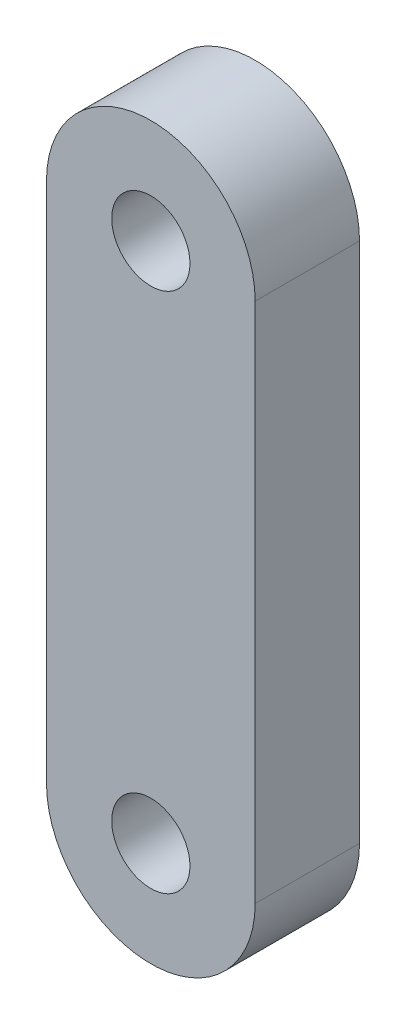
ISO-10303-21;
HEADER;
FILE_DESCRIPTION(('STEP AP214'),'2;1');
FILE_NAME('part.step','',(''),(''),'','','');
FILE_SCHEMA(('AUTOMOTIVE_DESIGN { 1 0 10303 214 1 1 1 1 }'));
ENDSEC;
DATA;
#1=APPLICATION_CONTEXT('core data for automotive mechanical design processes');
#2=APPLICATION_PROTOCOL_DEFINITION('international standard','automotive_design',2000,#1);
#3=PRODUCT_CONTEXT('',#1,'mechanical');
#4=PRODUCT('Part','Part','',(#3));
#5=PRODUCT_RELATED_PRODUCT_CATEGORY('part','',(#4));
#6=PRODUCT_DEFINITION_FORMATION('','',#4);
#7=PRODUCT_DEFINITION_CONTEXT('part definition',#1,'design');
#8=PRODUCT_DEFINITION('design','',#6,#7);
#9=PRODUCT_DEFINITION_SHAPE('','',#8);
#10=(LENGTH_UNIT() NAMED_UNIT(*) SI_UNIT(.MILLI.,.METRE.));
#11=(NAMED_UNIT(*) PLANE_ANGLE_UNIT() SI_UNIT($,.RADIAN.));
#12=(NAMED_UNIT(*) SI_UNIT($,.STERADIAN.) SOLID_ANGLE_UNIT());
#13=UNCERTAINTY_MEASURE_WITH_UNIT(LENGTH_MEASURE(1.E-05),#10,'distance_accuracy_value','');
#14=(GEOMETRIC_REPRESENTATION_CONTEXT(3) GLOBAL_UNCERTAINTY_ASSIGNED_CONTEXT((#13)) GLOBAL_UNIT_ASSIGNED_CONTEXT((#10,
#11,#12)) REPRESENTATION_CONTEXT('',''));
#15=CARTESIAN_POINT('',(0.,0.,0.));
#16=DIRECTION('',(0.,0.,1.));
#17=DIRECTION('',(1.,0.,0.));
#18=AXIS2_PLACEMENT_3D('',#15,#16,#17);
#19=CARTESIAN_POINT('',(0.,10.8389261744966,4.));
#20=DIRECTION('',(0.,0.,1.));
#21=DIRECTION('',(1.,0.,0.));
#22=AXIS2_PLACEMENT_3D('',#19,#20,#21);
#23=PLANE('',#22);
#24=CARTESIAN_POINT('',(0.,10.8389261744966,4.));
#25=DIRECTION('',(0.,0.,1.));
#26=DIRECTION('',(1.,0.,0.));
#27=AXIS2_PLACEMENT_3D('',#24,#25,#26);
#28=CIRCLE('',#27,1.5);
#29=CARTESIAN_POINT('',(1.5,10.8389261744966,4.));
#30=VERTEX_POINT('',#29);
#31=EDGE_CURVE('E112',#30,#30,#28,.T.);
#32=ORIENTED_EDGE('',*,*,#31,.F.);
#33=EDGE_LOOP('',(#32));
#34=FACE_BOUND('',#33,.T.);
#35=CARTESIAN_POINT('',(0.,10.8389261744966,4.));
#36=DIRECTION('',(0.,0.,1.));
#37=DIRECTION('',(1.,0.,0.));
#38=AXIS2_PLACEMENT_3D('',#35,#36,#37);
#39=CIRCLE('',#38,4.);
#40=CARTESIAN_POINT('',(4.,10.8389261744966,4.));
#41=VERTEX_POINT('',#40);
#42=CARTESIAN_POINT('',(-4.,10.8389261744966,4.));
#43=VERTEX_POINT('',#42);
#44=EDGE_CURVE('E92',#41,#43,#39,.T.);
#45=ORIENTED_EDGE('',*,*,#44,.T.);
#46=DIRECTION('',(0.,-1.,0.));
#47=VECTOR('',#46,1.);
#48=CARTESIAN_POINT('',(-4.,10.8389261744966,4.));
#49=LINE('',#48,#47);
#50=CARTESIAN_POINT('',(-4.,-9.16107382550336,4.));
#51=VERTEX_POINT('',#50);
#52=EDGE_CURVE('E87',#43,#51,#49,.T.);
#53=ORIENTED_EDGE('',*,*,#52,.T.);
#54=CARTESIAN_POINT('',(0.,-9.16107382550336,4.));
#55=DIRECTION('',(0.,0.,1.));
#56=DIRECTION('',(1.,0.,0.));
#57=AXIS2_PLACEMENT_3D('',#54,#55,#56);
#58=CIRCLE('',#57,4.);
#59=CARTESIAN_POINT('',(4.,-9.16107382550336,4.));
#60=VERTEX_POINT('',#59);
#61=EDGE_CURVE('E90',#51,#60,#58,.T.);
#62=ORIENTED_EDGE('',*,*,#61,.T.);
#63=DIRECTION('',(0.,1.,0.));
#64=VECTOR('',#63,1.);
#65=CARTESIAN_POINT('',(4.,10.8389261744966,4.));
#66=LINE('',#65,#64);
#67=EDGE_CURVE('E57',#60,#41,#66,.T.);
#68=ORIENTED_EDGE('',*,*,#67,.T.);
#69=EDGE_LOOP('',(#45,#53,#62,#68));
#70=FACE_BOUND('',#69,.T.);
#71=CARTESIAN_POINT('',(0.,-9.16107382550336,4.));
#72=DIRECTION('',(0.,0.,1.));
#73=DIRECTION('',(1.,0.,0.));
#74=AXIS2_PLACEMENT_3D('',#71,#72,#73);
#75=CIRCLE('',#74,1.5);
#76=CARTESIAN_POINT('',(1.5,-9.16107382550336,4.));
#77=VERTEX_POINT('',#76);
#78=EDGE_CURVE('E134',#77,#77,#75,.T.);
#79=ORIENTED_EDGE('',*,*,#78,.F.);
#80=EDGE_LOOP('',(#79));
#81=FACE_BOUND('',#80,.T.);
#82=ADVANCED_FACE('F39',(#34,#70,#81),#23,.T.);
#83=CARTESIAN_POINT('',(0.,10.8389261744966,0.));
#84=DIRECTION('',(0.,0.,1.));
#85=DIRECTION('',(1.,0.,0.));
#86=AXIS2_PLACEMENT_3D('',#83,#84,#85);
#87=PLANE('',#86);
#88=CARTESIAN_POINT('',(0.,10.8389261744966,0.));
#89=DIRECTION('',(0.,0.,1.));
#90=DIRECTION('',(1.,0.,0.));
#91=AXIS2_PLACEMENT_3D('',#88,#89,#90);
#92=CIRCLE('',#91,4.);
#93=CARTESIAN_POINT('',(4.,10.8389261744966,0.));
#94=VERTEX_POINT('',#93);
#95=CARTESIAN_POINT('',(-4.,10.8389261744966,0.));
#96=VERTEX_POINT('',#95);
#97=EDGE_CURVE('E108',#94,#96,#92,.T.);
#98=ORIENTED_EDGE('',*,*,#97,.F.);
#99=DIRECTION('',(0.,1.,0.));
#100=VECTOR('',#99,1.);
#101=CARTESIAN_POINT('',(4.,10.8389261744966,0.));
#102=LINE('',#101,#100);
#103=CARTESIAN_POINT('',(4.,-9.16107382550336,0.));
#104=VERTEX_POINT('',#103);
#105=EDGE_CURVE('E80',#104,#94,#102,.T.);
#106=ORIENTED_EDGE('',*,*,#105,.F.);
#107=CARTESIAN_POINT('',(0.,-9.16107382550336,0.));
#108=DIRECTION('',(0.,0.,1.));
#109=DIRECTION('',(1.,0.,0.));
#110=AXIS2_PLACEMENT_3D('',#107,#108,#109);
#111=CIRCLE('',#110,4.);
#112=CARTESIAN_POINT('',(-4.,-9.16107382550336,0.));
#113=VERTEX_POINT('',#112);
#114=EDGE_CURVE('E74',#113,#104,#111,.T.);
#115=ORIENTED_EDGE('',*,*,#114,.F.);
#116=DIRECTION('',(0.,-1.,0.));
#117=VECTOR('',#116,1.);
#118=CARTESIAN_POINT('',(-4.,10.8389261744966,0.));
#119=LINE('',#118,#117);
#120=EDGE_CURVE('E97',#96,#113,#119,.T.);
#121=ORIENTED_EDGE('',*,*,#120,.F.);
#122=EDGE_LOOP('',(#98,#106,#115,#121));
#123=FACE_BOUND('',#122,.T.);
#124=CARTESIAN_POINT('',(0.,10.8389261744966,0.));
#125=DIRECTION('',(0.,0.,1.));
#126=DIRECTION('',(1.,0.,0.));
#127=AXIS2_PLACEMENT_3D('',#124,#125,#126);
#128=CIRCLE('',#127,1.5);
#129=CARTESIAN_POINT('',(1.5,10.8389261744966,0.));
#130=VERTEX_POINT('',#129);
#131=EDGE_CURVE('E130',#130,#130,#128,.T.);
#132=ORIENTED_EDGE('',*,*,#131,.T.);
#133=EDGE_LOOP('',(#132));
#134=FACE_BOUND('',#133,.T.);
#135=CARTESIAN_POINT('',(0.,-9.16107382550336,0.));
#136=DIRECTION('',(0.,0.,1.));
#137=DIRECTION('',(1.,0.,0.));
#138=AXIS2_PLACEMENT_3D('',#135,#136,#137);
#139=CIRCLE('',#138,1.5);
#140=CARTESIAN_POINT('',(1.5,-9.16107382550336,0.));
#141=VERTEX_POINT('',#140);
#142=EDGE_CURVE('E138',#141,#141,#139,.T.);
#143=ORIENTED_EDGE('',*,*,#142,.T.);
#144=EDGE_LOOP('',(#143));
#145=FACE_BOUND('',#144,.T.);
#146=ADVANCED_FACE('F125',(#123,#134,#145),#87,.F.);
#147=CARTESIAN_POINT('',(0.,10.8389261744966,4.));
#148=DIRECTION('',(0.,0.,-1.));
#149=DIRECTION('',(-1.,0.,0.));
#150=AXIS2_PLACEMENT_3D('',#147,#148,#149);
#151=CYLINDRICAL_SURFACE('',#150,4.);
#152=ORIENTED_EDGE('',*,*,#97,.T.);
#153=DIRECTION('',(0.,0.,-1.));
#154=VECTOR('',#153,1.);
#155=CARTESIAN_POINT('',(-4.,10.8389261744966,4.));
#156=LINE('',#155,#154);
#157=EDGE_CURVE('E11',#43,#96,#156,.T.);
#158=ORIENTED_EDGE('',*,*,#157,.F.);
#159=ORIENTED_EDGE('',*,*,#44,.F.);
#160=DIRECTION('',(0.,0.,-1.));
#161=VECTOR('',#160,1.);
#162=CARTESIAN_POINT('',(4.,10.8389261744966,4.));
#163=LINE('',#162,#161);
#164=EDGE_CURVE('E104',#41,#94,#163,.T.);
#165=ORIENTED_EDGE('',*,*,#164,.T.);
#166=EDGE_LOOP('',(#152,#158,#159,#165));
#167=FACE_BOUND('',#166,.T.);
#168=ADVANCED_FACE('F41',(#167),#151,.T.);
#169=CARTESIAN_POINT('',(-4.,10.8389261744966,4.));
#170=DIRECTION('',(1.,0.,0.));
#171=DIRECTION('',(0.,1.,0.));
#172=AXIS2_PLACEMENT_3D('',#169,#170,#171);
#173=PLANE('',#172);
#174=ORIENTED_EDGE('',*,*,#120,.T.);
#175=DIRECTION('',(0.,0.,-1.));
#176=VECTOR('',#175,1.);
#177=CARTESIAN_POINT('',(-4.,-9.16107382550336,4.));
#178=LINE('',#177,#176);
#179=EDGE_CURVE('E49',#51,#113,#178,.T.);
#180=ORIENTED_EDGE('',*,*,#179,.F.);
#181=ORIENTED_EDGE('',*,*,#52,.F.);
#182=ORIENTED_EDGE('',*,*,#157,.T.);
#183=EDGE_LOOP('',(#174,#180,#181,#182));
#184=FACE_BOUND('',#183,.T.);
#185=ADVANCED_FACE('F96',(#184),#173,.F.);
#186=CARTESIAN_POINT('',(0.,-9.16107382550336,4.));
#187=DIRECTION('',(0.,0.,-1.));
#188=DIRECTION('',(-1.,0.,0.));
#189=AXIS2_PLACEMENT_3D('',#186,#187,#188);
#190=CYLINDRICAL_SURFACE('',#189,4.);
#191=ORIENTED_EDGE('',*,*,#114,.T.);
#192=DIRECTION('',(0.,0.,-1.));
#193=VECTOR('',#192,1.);
#194=CARTESIAN_POINT('',(4.,-9.16107382550336,4.));
#195=LINE('',#194,#193);
#196=EDGE_CURVE('E99',#60,#104,#195,.T.);
#197=ORIENTED_EDGE('',*,*,#196,.F.);
#198=ORIENTED_EDGE('',*,*,#61,.F.);
#199=ORIENTED_EDGE('',*,*,#179,.T.);
#200=EDGE_LOOP('',(#191,#197,#198,#199));
#201=FACE_BOUND('',#200,.T.);
#202=ADVANCED_FACE('F100',(#201),#190,.T.);
#203=CARTESIAN_POINT('',(4.,10.8389261744966,4.));
#204=DIRECTION('',(-1.,0.,0.));
#205=DIRECTION('',(0.,-1.,0.));
#206=AXIS2_PLACEMENT_3D('',#203,#204,#205);
#207=PLANE('',#206);
#208=ORIENTED_EDGE('',*,*,#105,.T.);
#209=ORIENTED_EDGE('',*,*,#164,.F.);
#210=ORIENTED_EDGE('',*,*,#67,.F.);
#211=ORIENTED_EDGE('',*,*,#196,.T.);
#212=EDGE_LOOP('',(#208,#209,#210,#211));
#213=FACE_BOUND('',#212,.T.);
#214=ADVANCED_FACE('F122',(#213),#207,.F.);
#215=CARTESIAN_POINT('',(0.,10.8389261744966,4.));
#216=DIRECTION('',(0.,0.,-1.));
#217=DIRECTION('',(-1.,0.,0.));
#218=AXIS2_PLACEMENT_3D('',#215,#216,#217);
#219=CYLINDRICAL_SURFACE('',#218,1.5);
#220=ORIENTED_EDGE('',*,*,#31,.T.);
#221=EDGE_LOOP('',(#220));
#222=FACE_BOUND('',#221,.T.);
#223=ORIENTED_EDGE('',*,*,#131,.F.);
#224=EDGE_LOOP('',(#223));
#225=FACE_BOUND('',#224,.T.);
#226=ADVANCED_FACE('F157',(#222,#225),#219,.F.);
#227=CARTESIAN_POINT('',(0.,-9.16107382550336,4.));
#228=DIRECTION('',(0.,0.,-1.));
#229=DIRECTION('',(-1.,0.,0.));
#230=AXIS2_PLACEMENT_3D('',#227,#228,#229);
#231=CYLINDRICAL_SURFACE('',#230,1.5);
#232=ORIENTED_EDGE('',*,*,#78,.T.);
#233=EDGE_LOOP('',(#232));
#234=FACE_BOUND('',#233,.T.);
#235=ORIENTED_EDGE('',*,*,#142,.F.);
#236=EDGE_LOOP('',(#235));
#237=FACE_BOUND('',#236,.T.);
#238=ADVANCED_FACE('F146',(#234,#237),#231,.F.);
#239=CLOSED_SHELL('',(#82,#146,#168,#185,#202,#214,#226,#238));
#240=MANIFOLD_SOLID_BREP('B2',#239);
#241=ADVANCED_BREP_SHAPE_REPRESENTATION('',(#18,#240),#14);
#242=SHAPE_DEFINITION_REPRESENTATION(#9,#241);
ENDSEC;
END-ISO-10303-21;
